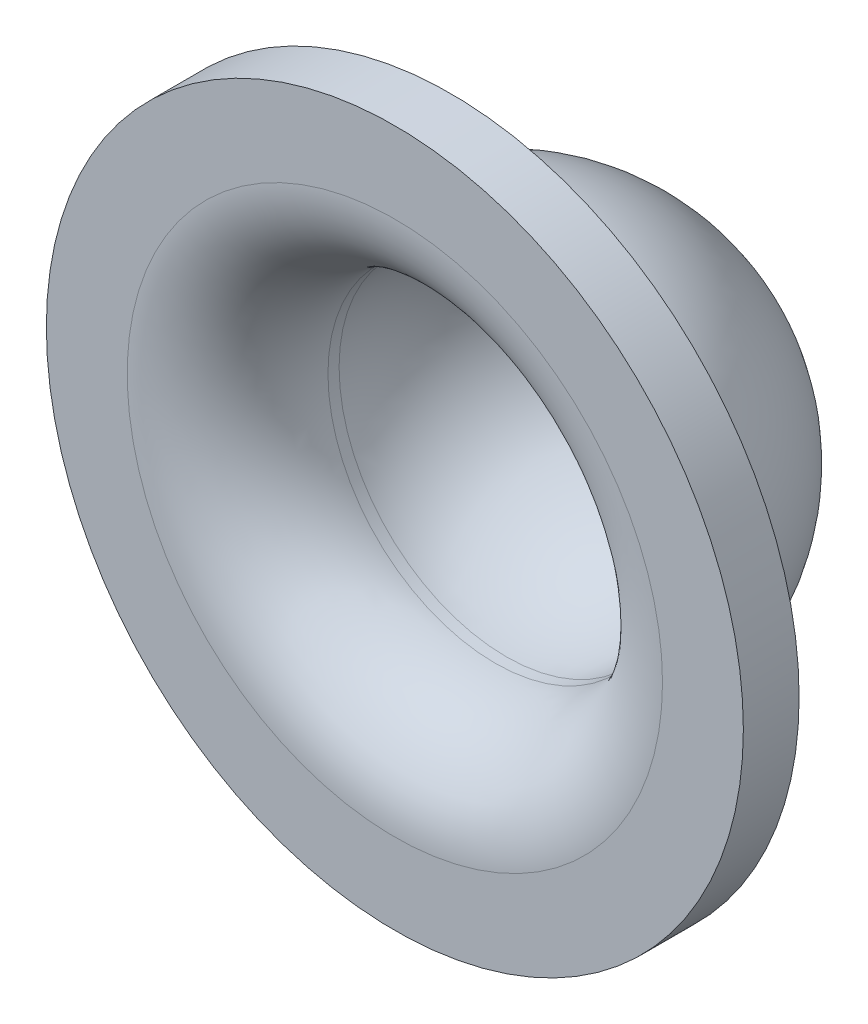
ISO-10303-21;
HEADER;
FILE_DESCRIPTION(('STEP AP214'),'2;1');
FILE_NAME('part.step','',(''),(''),'','','');
FILE_SCHEMA(('AUTOMOTIVE_DESIGN { 1 0 10303 214 1 1 1 1 }'));
ENDSEC;
DATA;
#1=APPLICATION_CONTEXT('core data for automotive mechanical design processes');
#2=APPLICATION_PROTOCOL_DEFINITION('international standard','automotive_design',2000,#1);
#3=PRODUCT_CONTEXT('',#1,'mechanical');
#4=PRODUCT('Part','Part','',(#3));
#5=PRODUCT_RELATED_PRODUCT_CATEGORY('part','',(#4));
#6=PRODUCT_DEFINITION_FORMATION('','',#4);
#7=PRODUCT_DEFINITION_CONTEXT('part definition',#1,'design');
#8=PRODUCT_DEFINITION('design','',#6,#7);
#9=PRODUCT_DEFINITION_SHAPE('','',#8);
#10=(LENGTH_UNIT() NAMED_UNIT(*) SI_UNIT(.MILLI.,.METRE.));
#11=(NAMED_UNIT(*) PLANE_ANGLE_UNIT() SI_UNIT($,.RADIAN.));
#12=(NAMED_UNIT(*) SI_UNIT($,.STERADIAN.) SOLID_ANGLE_UNIT());
#13=UNCERTAINTY_MEASURE_WITH_UNIT(LENGTH_MEASURE(1.E-05),#10,'distance_accuracy_value','');
#14=(GEOMETRIC_REPRESENTATION_CONTEXT(3) GLOBAL_UNCERTAINTY_ASSIGNED_CONTEXT((#13)) GLOBAL_UNIT_ASSIGNED_CONTEXT((#10,
#11,#12)) REPRESENTATION_CONTEXT('',''));
#15=CARTESIAN_POINT('',(0.,0.,0.));
#16=DIRECTION('',(0.,0.,1.));
#17=DIRECTION('',(1.,0.,0.));
#18=AXIS2_PLACEMENT_3D('',#15,#16,#17);
#19=CARTESIAN_POINT('',(0.,0.,0.));
#20=DIRECTION('',(0.,0.,1.));
#21=DIRECTION('',(1.,0.,0.));
#22=AXIS2_PLACEMENT_3D('',#19,#20,#21);
#23=PLANE('',#22);
#24=CARTESIAN_POINT('',(0.,0.,0.));
#25=DIRECTION('',(0.,0.,1.));
#26=DIRECTION('',(1.,0.,0.));
#27=AXIS2_PLACEMENT_3D('',#24,#25,#26);
#28=CIRCLE('',#27,4.80000000000001);
#29=CARTESIAN_POINT('',(4.80000000000001,0.,0.));
#30=VERTEX_POINT('',#29);
#31=EDGE_CURVE('E61',#30,#30,#28,.T.);
#32=ORIENTED_EDGE('',*,*,#31,.F.);
#33=EDGE_LOOP('',(#32));
#34=FACE_BOUND('',#33,.T.);
#35=CARTESIAN_POINT('',(0.,0.,0.));
#36=DIRECTION('',(0.,0.,1.));
#37=DIRECTION('',(1.,0.,0.));
#38=AXIS2_PLACEMENT_3D('',#35,#36,#37);
#39=CIRCLE('',#38,6.25);
#40=CARTESIAN_POINT('',(6.25,0.,0.));
#41=VERTEX_POINT('',#40);
#42=EDGE_CURVE('E10',#41,#41,#39,.T.);
#43=ORIENTED_EDGE('',*,*,#42,.T.);
#44=EDGE_LOOP('',(#43));
#45=FACE_BOUND('',#44,.T.);
#46=ADVANCED_FACE('F39',(#34,#45),#23,.T.);
#47=CARTESIAN_POINT('',(0.,0.,-1.));
#48=DIRECTION('',(0.,0.,1.));
#49=DIRECTION('',(1.,0.,0.));
#50=AXIS2_PLACEMENT_3D('',#47,#48,#49);
#51=CYLINDRICAL_SURFACE('',#50,6.25);
#52=CARTESIAN_POINT('',(0.,0.,-1.));
#53=DIRECTION('',(0.,0.,1.));
#54=DIRECTION('',(1.,0.,0.));
#55=AXIS2_PLACEMENT_3D('',#52,#53,#54);
#56=CIRCLE('',#55,6.25);
#57=CARTESIAN_POINT('',(6.25,0.,-1.));
#58=VERTEX_POINT('',#57);
#59=EDGE_CURVE('E45',#58,#58,#56,.T.);
#60=ORIENTED_EDGE('',*,*,#59,.T.);
#61=EDGE_LOOP('',(#60));
#62=FACE_BOUND('',#61,.T.);
#63=ORIENTED_EDGE('',*,*,#42,.F.);
#64=EDGE_LOOP('',(#63));
#65=FACE_BOUND('',#64,.T.);
#66=ADVANCED_FACE('F75',(#62,#65),#51,.T.);
#67=CARTESIAN_POINT('',(0.,0.,-1.));
#68=DIRECTION('',(0.,0.,1.));
#69=DIRECTION('',(1.,0.,0.));
#70=AXIS2_PLACEMENT_3D('',#67,#68,#69);
#71=PLANE('',#70);
#72=ORIENTED_EDGE('',*,*,#59,.F.);
#73=EDGE_LOOP('',(#72));
#74=FACE_BOUND('',#73,.T.);
#75=CARTESIAN_POINT('',(0.,0.,-1.));
#76=DIRECTION('',(0.,0.,1.));
#77=DIRECTION('',(1.,0.,0.));
#78=AXIS2_PLACEMENT_3D('',#75,#76,#77);
#79=CIRCLE('',#78,4.80000000000001);
#80=CARTESIAN_POINT('',(4.80000000000001,0.,-1.));
#81=VERTEX_POINT('',#80);
#82=EDGE_CURVE('E49',#81,#81,#79,.T.);
#83=ORIENTED_EDGE('',*,*,#82,.T.);
#84=EDGE_LOOP('',(#83));
#85=FACE_BOUND('',#84,.T.);
#86=ADVANCED_FACE('F81',(#74,#85),#71,.F.);
#87=CARTESIAN_POINT('',(0.,0.,-1.8));
#88=DIRECTION('',(0.,0.,1.));
#89=DIRECTION('',(1.,0.,0.));
#90=AXIS2_PLACEMENT_3D('',#87,#88,#89);
#91=TOROIDAL_SURFACE('',#90,4.8,0.8);
#92=ORIENTED_EDGE('',*,*,#82,.F.);
#93=EDGE_LOOP('',(#92));
#94=FACE_BOUND('',#93,.T.);
#95=CARTESIAN_POINT('',(0.,0.,-1.80000000000001));
#96=DIRECTION('',(0.,0.,1.));
#97=DIRECTION('',(1.,0.,0.));
#98=AXIS2_PLACEMENT_3D('',#95,#96,#97);
#99=CIRCLE('',#98,4.);
#100=CARTESIAN_POINT('',(4.,0.,-1.80000000000001));
#101=VERTEX_POINT('',#100);
#102=EDGE_CURVE('E53',#101,#101,#99,.T.);
#103=ORIENTED_EDGE('',*,*,#102,.T.);
#104=EDGE_LOOP('',(#103));
#105=FACE_BOUND('',#104,.T.);
#106=ADVANCED_FACE('F85',(#94,#105),#91,.F.);
#107=CARTESIAN_POINT('',(0.,0.,-1.));
#108=DIRECTION('',(0.,0.,1.));
#109=DIRECTION('',(1.,0.,0.));
#110=AXIS2_PLACEMENT_3D('',#107,#108,#109);
#111=CYLINDRICAL_SURFACE('',#110,4.);
#112=ORIENTED_EDGE('',*,*,#102,.F.);
#113=EDGE_LOOP('',(#112));
#114=FACE_BOUND('',#113,.T.);
#115=CARTESIAN_POINT('',(0.,0.,-2.));
#116=DIRECTION('',(0.,0.,1.));
#117=DIRECTION('',(1.,0.,0.));
#118=AXIS2_PLACEMENT_3D('',#115,#116,#117);
#119=CIRCLE('',#118,4.);
#120=CARTESIAN_POINT('',(4.,0.,-2.));
#121=VERTEX_POINT('',#120);
#122=EDGE_CURVE('E58',#121,#121,#119,.T.);
#123=ORIENTED_EDGE('',*,*,#122,.T.);
#124=EDGE_LOOP('',(#123));
#125=FACE_BOUND('',#124,.T.);
#126=ADVANCED_FACE('F92',(#114,#125),#111,.T.);
#127=CARTESIAN_POINT('',(0.,0.,-2.));
#128=DIRECTION('',(0.,0.,1.));
#129=DIRECTION('',(1.,0.,0.));
#130=AXIS2_PLACEMENT_3D('',#127,#128,#129);
#131=SPHERICAL_SURFACE('',#130,4.);
#132=ORIENTED_EDGE('',*,*,#122,.F.);
#133=EDGE_LOOP('',(#132));
#134=FACE_BOUND('',#133,.T.);
#135=ADVANCED_FACE('F96',(#134),#131,.T.);
#136=CARTESIAN_POINT('',(0.,0.,-1.8));
#137=DIRECTION('',(0.,0.,1.));
#138=DIRECTION('',(1.,0.,0.));
#139=AXIS2_PLACEMENT_3D('',#136,#137,#138);
#140=TOROIDAL_SURFACE('',#139,4.8,1.8);
#141=ORIENTED_EDGE('',*,*,#31,.T.);
#142=EDGE_LOOP('',(#141));
#143=FACE_BOUND('',#142,.T.);
#144=CARTESIAN_POINT('',(0.,0.,-1.80000000000001));
#145=DIRECTION('',(0.,0.,1.));
#146=DIRECTION('',(1.,0.,0.));
#147=AXIS2_PLACEMENT_3D('',#144,#145,#146);
#148=CIRCLE('',#147,3.);
#149=CARTESIAN_POINT('',(3.,0.,-1.80000000000001));
#150=VERTEX_POINT('',#149);
#151=EDGE_CURVE('E65',#150,#150,#148,.T.);
#152=ORIENTED_EDGE('',*,*,#151,.F.);
#153=EDGE_LOOP('',(#152));
#154=FACE_BOUND('',#153,.T.);
#155=ADVANCED_FACE('F71',(#143,#154),#140,.T.);
#156=CARTESIAN_POINT('',(0.,0.,-1.));
#157=DIRECTION('',(0.,0.,1.));
#158=DIRECTION('',(1.,0.,0.));
#159=AXIS2_PLACEMENT_3D('',#156,#157,#158);
#160=CYLINDRICAL_SURFACE('',#159,3.);
#161=ORIENTED_EDGE('',*,*,#151,.T.);
#162=EDGE_LOOP('',(#161));
#163=FACE_BOUND('',#162,.T.);
#164=CARTESIAN_POINT('',(0.,0.,-2.));
#165=DIRECTION('',(0.,0.,1.));
#166=DIRECTION('',(1.,0.,0.));
#167=AXIS2_PLACEMENT_3D('',#164,#165,#166);
#168=CIRCLE('',#167,3.);
#169=CARTESIAN_POINT('',(3.,0.,-2.));
#170=VERTEX_POINT('',#169);
#171=EDGE_CURVE('E62',#170,#170,#168,.T.);
#172=ORIENTED_EDGE('',*,*,#171,.F.);
#173=EDGE_LOOP('',(#172));
#174=FACE_BOUND('',#173,.T.);
#175=ADVANCED_FACE('F103',(#163,#174),#160,.F.);
#176=CARTESIAN_POINT('',(0.,0.,-2.));
#177=DIRECTION('',(0.,0.,1.));
#178=DIRECTION('',(1.,0.,0.));
#179=AXIS2_PLACEMENT_3D('',#176,#177,#178);
#180=SPHERICAL_SURFACE('',#179,3.);
#181=ORIENTED_EDGE('',*,*,#171,.T.);
#182=EDGE_LOOP('',(#181));
#183=FACE_BOUND('',#182,.T.);
#184=ADVANCED_FACE('F100',(#183),#180,.F.);
#185=CLOSED_SHELL('',(#46,#66,#86,#106,#126,#135,#155,#175,#184));
#186=MANIFOLD_SOLID_BREP('B2',#185);
#187=ADVANCED_BREP_SHAPE_REPRESENTATION('',(#18,#186),#14);
#188=SHAPE_DEFINITION_REPRESENTATION(#9,#187);
ENDSEC;
END-ISO-10303-21;
